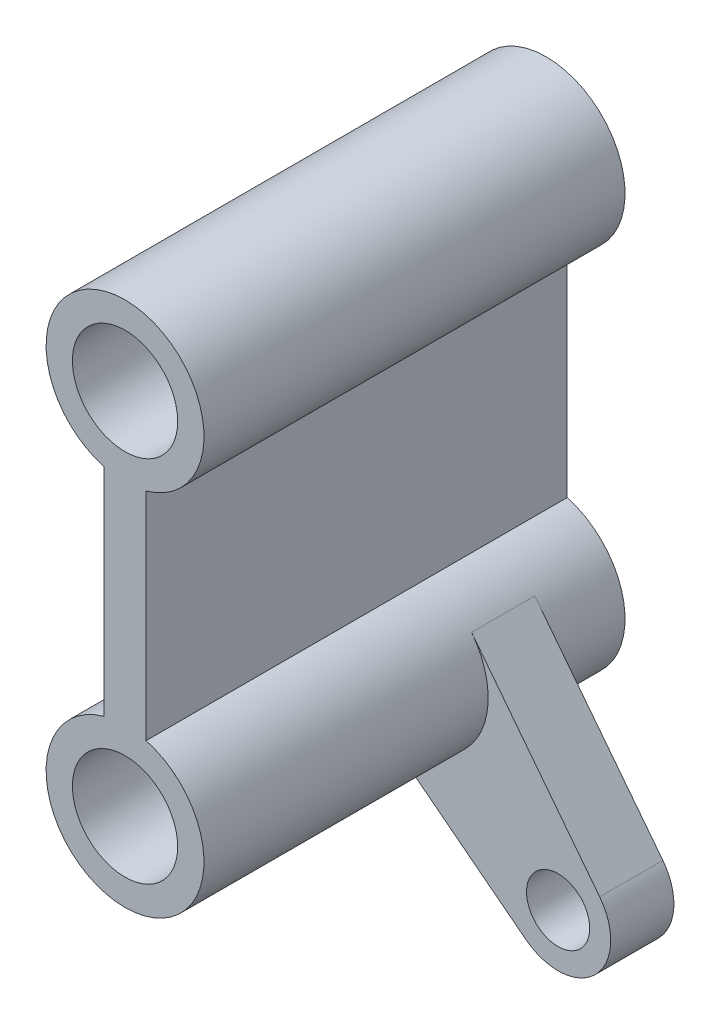
ISO-10303-21;
HEADER;
FILE_DESCRIPTION(('STEP AP214'),'2;1');
FILE_NAME('part.step','',(''),(''),'','','');
FILE_SCHEMA(('AUTOMOTIVE_DESIGN { 1 0 10303 214 1 1 1 1 }'));
ENDSEC;
DATA;
#1=APPLICATION_CONTEXT('core data for automotive mechanical design processes');
#2=APPLICATION_PROTOCOL_DEFINITION('international standard','automotive_design',2000,#1);
#3=PRODUCT_CONTEXT('',#1,'mechanical');
#4=PRODUCT('Part','Part','',(#3));
#5=PRODUCT_RELATED_PRODUCT_CATEGORY('part','',(#4));
#6=PRODUCT_DEFINITION_FORMATION('','',#4);
#7=PRODUCT_DEFINITION_CONTEXT('part definition',#1,'design');
#8=PRODUCT_DEFINITION('design','',#6,#7);
#9=PRODUCT_DEFINITION_SHAPE('','',#8);
#10=(LENGTH_UNIT() NAMED_UNIT(*) SI_UNIT(.MILLI.,.METRE.));
#11=(NAMED_UNIT(*) PLANE_ANGLE_UNIT() SI_UNIT($,.RADIAN.));
#12=(NAMED_UNIT(*) SI_UNIT($,.STERADIAN.) SOLID_ANGLE_UNIT());
#13=UNCERTAINTY_MEASURE_WITH_UNIT(LENGTH_MEASURE(1.E-05),#10,'distance_accuracy_value','');
#14=(GEOMETRIC_REPRESENTATION_CONTEXT(3) GLOBAL_UNCERTAINTY_ASSIGNED_CONTEXT((#13)) GLOBAL_UNIT_ASSIGNED_CONTEXT((#10,
#11,#12)) REPRESENTATION_CONTEXT('',''));
#15=CARTESIAN_POINT('',(0.,0.,0.));
#16=DIRECTION('',(0.,0.,1.));
#17=DIRECTION('',(1.,0.,0.));
#18=AXIS2_PLACEMENT_3D('',#15,#16,#17);
#19=CARTESIAN_POINT('',(0.,0.,40.));
#20=DIRECTION('',(0.,0.,-1.));
#21=DIRECTION('',(-1.,0.,0.));
#22=AXIS2_PLACEMENT_3D('',#19,#20,#21);
#23=CYLINDRICAL_SURFACE('',#22,7.5);
#24=DIRECTION('',(0.,0.,1.));
#25=VECTOR('',#24,1.);
#26=CARTESIAN_POINT('',(5.92461830751323,4.59879309278847,7.));
#27=LINE('',#26,#25);
#28=CARTESIAN_POINT('',(5.92461830751323,4.59879309278847,7.));
#29=VERTEX_POINT('',#28);
#30=CARTESIAN_POINT('',(5.92461830751324,4.59879309278848,13.));
#31=VERTEX_POINT('',#30);
#32=EDGE_CURVE('E62',#29,#31,#27,.T.);
#33=ORIENTED_EDGE('',*,*,#32,.F.);
#34=CARTESIAN_POINT('',(0.,0.,7.));
#35=DIRECTION('',(0.,0.,-1.));
#36=DIRECTION('',(-1.,0.,0.));
#37=AXIS2_PLACEMENT_3D('',#34,#35,#36);
#38=CIRCLE('',#37,7.5);
#39=CARTESIAN_POINT('',(-4.59879309278845,-5.92461830751325,7.));
#40=VERTEX_POINT('',#39);
#41=EDGE_CURVE('E66',#29,#40,#38,.T.);
#42=ORIENTED_EDGE('',*,*,#41,.T.);
#43=DIRECTION('',(0.,0.,1.));
#44=VECTOR('',#43,1.);
#45=CARTESIAN_POINT('',(-4.59879309278846,-5.92461830751325,7.));
#46=LINE('',#45,#44);
#47=CARTESIAN_POINT('',(-4.59879309278846,-5.92461830751325,13.));
#48=VERTEX_POINT('',#47);
#49=EDGE_CURVE('E140',#40,#48,#46,.T.);
#50=ORIENTED_EDGE('',*,*,#49,.T.);
#51=CARTESIAN_POINT('',(0.,0.,13.));
#52=DIRECTION('',(0.,0.,-1.));
#53=DIRECTION('',(-1.,0.,0.));
#54=AXIS2_PLACEMENT_3D('',#51,#52,#53);
#55=CIRCLE('',#54,7.5);
#56=EDGE_CURVE('E146',#31,#48,#55,.T.);
#57=ORIENTED_EDGE('',*,*,#56,.F.);
#58=EDGE_LOOP('',(#33,#42,#50,#57));
#59=FACE_BOUND('',#58,.T.);
#60=CARTESIAN_POINT('',(0.,0.,0.));
#61=DIRECTION('',(0.,0.,1.));
#62=DIRECTION('',(1.,0.,0.));
#63=AXIS2_PLACEMENT_3D('',#60,#61,#62);
#64=CIRCLE('',#63,7.5);
#65=CARTESIAN_POINT('',(-2.,7.22841614740048,0.));
#66=VERTEX_POINT('',#65);
#67=CARTESIAN_POINT('',(2.,7.22841614740048,0.));
#68=VERTEX_POINT('',#67);
#69=EDGE_CURVE('E150',#66,#68,#64,.T.);
#70=ORIENTED_EDGE('',*,*,#69,.T.);
#71=DIRECTION('',(0.,0.,-1.));
#72=VECTOR('',#71,1.);
#73=CARTESIAN_POINT('',(2.,7.22841614740048,40.));
#74=LINE('',#73,#72);
#75=CARTESIAN_POINT('',(2.,7.22841614740048,40.));
#76=VERTEX_POINT('',#75);
#77=EDGE_CURVE('E13',#76,#68,#74,.T.);
#78=ORIENTED_EDGE('',*,*,#77,.F.);
#79=CARTESIAN_POINT('',(0.,0.,40.));
#80=DIRECTION('',(0.,0.,1.));
#81=DIRECTION('',(1.,0.,0.));
#82=AXIS2_PLACEMENT_3D('',#79,#80,#81);
#83=CIRCLE('',#82,7.5);
#84=CARTESIAN_POINT('',(-2.,7.22841614740048,40.));
#85=VERTEX_POINT('',#84);
#86=EDGE_CURVE('E151',#85,#76,#83,.T.);
#87=ORIENTED_EDGE('',*,*,#86,.F.);
#88=DIRECTION('',(0.,0.,-1.));
#89=VECTOR('',#88,1.);
#90=CARTESIAN_POINT('',(-2.,7.22841614740048,40.));
#91=LINE('',#90,#89);
#92=EDGE_CURVE('E168',#85,#66,#91,.T.);
#93=ORIENTED_EDGE('',*,*,#92,.T.);
#94=EDGE_LOOP('',(#70,#78,#87,#93));
#95=FACE_BOUND('',#94,.T.);
#96=ADVANCED_FACE('F48',(#59,#95),#23,.T.);
#97=CARTESIAN_POINT('',(2.,0.,40.));
#98=DIRECTION('',(-1.,0.,0.));
#99=DIRECTION('',(0.,-1.,0.));
#100=AXIS2_PLACEMENT_3D('',#97,#98,#99);
#101=PLANE('',#100);
#102=DIRECTION('',(0.,1.,0.));
#103=VECTOR('',#102,1.);
#104=CARTESIAN_POINT('',(2.,0.,0.));
#105=LINE('',#104,#103);
#106=CARTESIAN_POINT('',(2.,27.7715838525995,0.));
#107=VERTEX_POINT('',#106);
#108=EDGE_CURVE('E171',#68,#107,#105,.T.);
#109=ORIENTED_EDGE('',*,*,#108,.T.);
#110=DIRECTION('',(0.,0.,-1.));
#111=VECTOR('',#110,1.);
#112=CARTESIAN_POINT('',(2.,27.7715838525995,40.));
#113=LINE('',#112,#111);
#114=CARTESIAN_POINT('',(2.,27.7715838525995,40.));
#115=VERTEX_POINT('',#114);
#116=EDGE_CURVE('E55',#115,#107,#113,.T.);
#117=ORIENTED_EDGE('',*,*,#116,.F.);
#118=DIRECTION('',(0.,1.,0.));
#119=VECTOR('',#118,1.);
#120=CARTESIAN_POINT('',(2.,0.,40.));
#121=LINE('',#120,#119);
#122=EDGE_CURVE('E154',#76,#115,#121,.T.);
#123=ORIENTED_EDGE('',*,*,#122,.F.);
#124=ORIENTED_EDGE('',*,*,#77,.T.);
#125=EDGE_LOOP('',(#109,#117,#123,#124));
#126=FACE_BOUND('',#125,.T.);
#127=ADVANCED_FACE('F207',(#126),#101,.F.);
#128=CARTESIAN_POINT('',(0.,35.,40.));
#129=DIRECTION('',(0.,0.,-1.));
#130=DIRECTION('',(-1.,0.,0.));
#131=AXIS2_PLACEMENT_3D('',#128,#129,#130);
#132=CYLINDRICAL_SURFACE('',#131,7.5);
#133=CARTESIAN_POINT('',(0.,35.,0.));
#134=DIRECTION('',(0.,0.,1.));
#135=DIRECTION('',(1.,0.,0.));
#136=AXIS2_PLACEMENT_3D('',#133,#134,#135);
#137=CIRCLE('',#136,7.5);
#138=CARTESIAN_POINT('',(-2.,27.7715838525995,0.));
#139=VERTEX_POINT('',#138);
#140=EDGE_CURVE('E173',#107,#139,#137,.T.);
#141=ORIENTED_EDGE('',*,*,#140,.T.);
#142=DIRECTION('',(0.,0.,-1.));
#143=VECTOR('',#142,1.);
#144=CARTESIAN_POINT('',(-2.,27.7715838525995,40.));
#145=LINE('',#144,#143);
#146=CARTESIAN_POINT('',(-2.,27.7715838525995,40.));
#147=VERTEX_POINT('',#146);
#148=EDGE_CURVE('E185',#147,#139,#145,.T.);
#149=ORIENTED_EDGE('',*,*,#148,.F.);
#150=CARTESIAN_POINT('',(0.,35.,40.));
#151=DIRECTION('',(0.,0.,1.));
#152=DIRECTION('',(1.,0.,0.));
#153=AXIS2_PLACEMENT_3D('',#150,#151,#152);
#154=CIRCLE('',#153,7.5);
#155=EDGE_CURVE('E157',#115,#147,#154,.T.);
#156=ORIENTED_EDGE('',*,*,#155,.F.);
#157=ORIENTED_EDGE('',*,*,#116,.T.);
#158=EDGE_LOOP('',(#141,#149,#156,#157));
#159=FACE_BOUND('',#158,.T.);
#160=ADVANCED_FACE('F191',(#159),#132,.T.);
#161=CARTESIAN_POINT('',(0.,0.,40.));
#162=DIRECTION('',(0.,0.,-1.));
#163=DIRECTION('',(-1.,0.,0.));
#164=AXIS2_PLACEMENT_3D('',#161,#162,#163);
#165=CYLINDRICAL_SURFACE('',#164,5.);
#166=CARTESIAN_POINT('',(0.,0.,40.));
#167=DIRECTION('',(0.,0.,1.));
#168=DIRECTION('',(1.,0.,0.));
#169=AXIS2_PLACEMENT_3D('',#166,#167,#168);
#170=CIRCLE('',#169,5.);
#171=CARTESIAN_POINT('',(5.,0.,40.));
#172=VERTEX_POINT('',#171);
#173=EDGE_CURVE('E162',#172,#172,#170,.T.);
#174=ORIENTED_EDGE('',*,*,#173,.T.);
#175=EDGE_LOOP('',(#174));
#176=FACE_BOUND('',#175,.T.);
#177=CARTESIAN_POINT('',(0.,0.,0.));
#178=DIRECTION('',(0.,0.,1.));
#179=DIRECTION('',(1.,0.,0.));
#180=AXIS2_PLACEMENT_3D('',#177,#178,#179);
#181=CIRCLE('',#180,5.);
#182=CARTESIAN_POINT('',(5.,0.,0.));
#183=VERTEX_POINT('',#182);
#184=EDGE_CURVE('E179',#183,#183,#181,.T.);
#185=ORIENTED_EDGE('',*,*,#184,.F.);
#186=EDGE_LOOP('',(#185));
#187=FACE_BOUND('',#186,.T.);
#188=ADVANCED_FACE('F216',(#176,#187),#165,.F.);
#189=CARTESIAN_POINT('',(-2.,0.,40.));
#190=DIRECTION('',(-1.,0.,0.));
#191=DIRECTION('',(0.,0.,1.));
#192=AXIS2_PLACEMENT_3D('',#189,#190,#191);
#193=PLANE('',#192);
#194=DIRECTION('',(0.,1.,0.));
#195=VECTOR('',#194,1.);
#196=CARTESIAN_POINT('',(-2.,0.,0.));
#197=LINE('',#196,#195);
#198=EDGE_CURVE('E176',#66,#139,#197,.T.);
#199=ORIENTED_EDGE('',*,*,#198,.F.);
#200=ORIENTED_EDGE('',*,*,#92,.F.);
#201=DIRECTION('',(0.,1.,0.));
#202=VECTOR('',#201,1.);
#203=CARTESIAN_POINT('',(-2.,0.,40.));
#204=LINE('',#203,#202);
#205=EDGE_CURVE('E159',#85,#147,#204,.T.);
#206=ORIENTED_EDGE('',*,*,#205,.T.);
#207=ORIENTED_EDGE('',*,*,#148,.T.);
#208=EDGE_LOOP('',(#199,#200,#206,#207));
#209=FACE_BOUND('',#208,.T.);
#210=ADVANCED_FACE('F200',(#209),#193,.T.);
#211=CARTESIAN_POINT('',(0.,35.,40.));
#212=DIRECTION('',(0.,0.,-1.));
#213=DIRECTION('',(-1.,0.,0.));
#214=AXIS2_PLACEMENT_3D('',#211,#212,#213);
#215=CYLINDRICAL_SURFACE('',#214,5.);
#216=CARTESIAN_POINT('',(0.,35.,40.));
#217=DIRECTION('',(0.,0.,1.));
#218=DIRECTION('',(1.,0.,0.));
#219=AXIS2_PLACEMENT_3D('',#216,#217,#218);
#220=CIRCLE('',#219,5.);
#221=CARTESIAN_POINT('',(5.,35.,40.));
#222=VERTEX_POINT('',#221);
#223=EDGE_CURVE('E165',#222,#222,#220,.T.);
#224=ORIENTED_EDGE('',*,*,#223,.T.);
#225=EDGE_LOOP('',(#224));
#226=FACE_BOUND('',#225,.T.);
#227=CARTESIAN_POINT('',(0.,35.,0.));
#228=DIRECTION('',(0.,0.,1.));
#229=DIRECTION('',(1.,0.,0.));
#230=AXIS2_PLACEMENT_3D('',#227,#228,#229);
#231=CIRCLE('',#230,5.);
#232=CARTESIAN_POINT('',(5.,35.,0.));
#233=VERTEX_POINT('',#232);
#234=EDGE_CURVE('E155',#233,#233,#231,.T.);
#235=ORIENTED_EDGE('',*,*,#234,.F.);
#236=EDGE_LOOP('',(#235));
#237=FACE_BOUND('',#236,.T.);
#238=ADVANCED_FACE('F221',(#226,#237),#215,.F.);
#239=CARTESIAN_POINT('',(0.,0.,40.));
#240=DIRECTION('',(0.,0.,1.));
#241=DIRECTION('',(1.,0.,0.));
#242=AXIS2_PLACEMENT_3D('',#239,#240,#241);
#243=PLANE('',#242);
#244=ORIENTED_EDGE('',*,*,#86,.T.);
#245=ORIENTED_EDGE('',*,*,#122,.T.);
#246=ORIENTED_EDGE('',*,*,#155,.T.);
#247=ORIENTED_EDGE('',*,*,#205,.F.);
#248=EDGE_LOOP('',(#244,#245,#246,#247));
#249=FACE_BOUND('',#248,.T.);
#250=ORIENTED_EDGE('',*,*,#173,.F.);
#251=EDGE_LOOP('',(#250));
#252=FACE_BOUND('',#251,.T.);
#253=ORIENTED_EDGE('',*,*,#223,.F.);
#254=EDGE_LOOP('',(#253));
#255=FACE_BOUND('',#254,.T.);
#256=ADVANCED_FACE('F204',(#249,#252,#255),#243,.T.);
#257=CARTESIAN_POINT('',(0.,0.,0.));
#258=DIRECTION('',(0.,0.,1.));
#259=DIRECTION('',(1.,0.,0.));
#260=AXIS2_PLACEMENT_3D('',#257,#258,#259);
#261=PLANE('',#260);
#262=ORIENTED_EDGE('',*,*,#69,.F.);
#263=ORIENTED_EDGE('',*,*,#198,.T.);
#264=ORIENTED_EDGE('',*,*,#140,.F.);
#265=ORIENTED_EDGE('',*,*,#108,.F.);
#266=EDGE_LOOP('',(#262,#263,#264,#265));
#267=FACE_BOUND('',#266,.T.);
#268=ORIENTED_EDGE('',*,*,#184,.T.);
#269=EDGE_LOOP('',(#268));
#270=FACE_BOUND('',#269,.T.);
#271=ORIENTED_EDGE('',*,*,#234,.T.);
#272=EDGE_LOOP('',(#271));
#273=FACE_BOUND('',#272,.T.);
#274=ADVANCED_FACE('F196',(#267,#270,#273),#261,.F.);
#275=CARTESIAN_POINT('',(0.,0.,7.));
#276=DIRECTION('',(0.,0.,-1.));
#277=DIRECTION('',(-1.,0.,0.));
#278=AXIS2_PLACEMENT_3D('',#275,#276,#277);
#279=PLANE('',#278);
#280=CARTESIAN_POINT('',(14.142135623731,-14.1421356237309,7.));
#281=DIRECTION('',(0.,0.,-1.));
#282=DIRECTION('',(-1.,0.,0.));
#283=AXIS2_PLACEMENT_3D('',#280,#281,#282);
#284=CIRCLE('',#283,3.);
#285=CARTESIAN_POINT('',(11.142135623731,-14.1421356237309,7.));
#286=VERTEX_POINT('',#285);
#287=EDGE_CURVE('E136',#286,#286,#284,.T.);
#288=ORIENTED_EDGE('',*,*,#287,.F.);
#289=EDGE_LOOP('',(#288));
#290=FACE_BOUND('',#289,.T.);
#291=ORIENTED_EDGE('',*,*,#41,.F.);
#292=DIRECTION('',(-0.613172412371797,0.789949107668431,0.));
#293=VECTOR('',#292,1.);
#294=CARTESIAN_POINT('',(5.92461830751323,4.59879309278847,7.));
#295=LINE('',#294,#293);
#296=CARTESIAN_POINT('',(18.0918811620731,-11.0762735618719,7.));
#297=VERTEX_POINT('',#296);
#298=EDGE_CURVE('E114',#297,#29,#295,.T.);
#299=ORIENTED_EDGE('',*,*,#298,.F.);
#300=CARTESIAN_POINT('',(14.142135623731,-14.1421356237309,7.));
#301=DIRECTION('',(0.,0.,-1.));
#302=DIRECTION('',(-1.,0.,0.));
#303=AXIS2_PLACEMENT_3D('',#300,#301,#302);
#304=CIRCLE('',#303,5.);
#305=CARTESIAN_POINT('',(11.076273561872,-18.0918811620731,7.));
#306=VERTEX_POINT('',#305);
#307=EDGE_CURVE('E122',#297,#306,#304,.T.);
#308=ORIENTED_EDGE('',*,*,#307,.T.);
#309=DIRECTION('',(-0.789949107668434,0.613172412371794,0.));
#310=VECTOR('',#309,1.);
#311=CARTESIAN_POINT('',(-4.59879309278846,-5.92461830751325,7.));
#312=LINE('',#311,#310);
#313=EDGE_CURVE('E127',#306,#40,#312,.T.);
#314=ORIENTED_EDGE('',*,*,#313,.T.);
#315=EDGE_LOOP('',(#291,#299,#308,#314));
#316=FACE_BOUND('',#315,.T.);
#317=ADVANCED_FACE('F129',(#290,#316),#279,.T.);
#318=CARTESIAN_POINT('',(0.,0.,13.));
#319=DIRECTION('',(0.,0.,-1.));
#320=DIRECTION('',(-1.,0.,0.));
#321=AXIS2_PLACEMENT_3D('',#318,#319,#320);
#322=PLANE('',#321);
#323=CARTESIAN_POINT('',(14.142135623731,-14.1421356237309,13.));
#324=DIRECTION('',(0.,0.,1.));
#325=DIRECTION('',(1.,0.,0.));
#326=AXIS2_PLACEMENT_3D('',#323,#324,#325);
#327=CIRCLE('',#326,3.);
#328=CARTESIAN_POINT('',(17.142135623731,-14.1421356237309,13.));
#329=VERTEX_POINT('',#328);
#330=EDGE_CURVE('E257',#329,#329,#327,.T.);
#331=ORIENTED_EDGE('',*,*,#330,.F.);
#332=EDGE_LOOP('',(#331));
#333=FACE_BOUND('',#332,.T.);
#334=DIRECTION('',(-0.613172412371797,0.789949107668431,0.));
#335=VECTOR('',#334,1.);
#336=CARTESIAN_POINT('',(5.92461830751323,4.59879309278847,13.));
#337=LINE('',#336,#335);
#338=CARTESIAN_POINT('',(18.0918811620731,-11.0762735618719,13.));
#339=VERTEX_POINT('',#338);
#340=EDGE_CURVE('E116',#339,#31,#337,.T.);
#341=ORIENTED_EDGE('',*,*,#340,.T.);
#342=ORIENTED_EDGE('',*,*,#56,.T.);
#343=DIRECTION('',(-0.789949107668434,0.613172412371794,0.));
#344=VECTOR('',#343,1.);
#345=CARTESIAN_POINT('',(-4.59879309278846,-5.92461830751325,13.));
#346=LINE('',#345,#344);
#347=CARTESIAN_POINT('',(11.076273561872,-18.0918811620731,13.));
#348=VERTEX_POINT('',#347);
#349=EDGE_CURVE('E130',#348,#48,#346,.T.);
#350=ORIENTED_EDGE('',*,*,#349,.F.);
#351=CARTESIAN_POINT('',(14.142135623731,-14.1421356237309,13.));
#352=DIRECTION('',(0.,0.,-1.));
#353=DIRECTION('',(-1.,0.,0.));
#354=AXIS2_PLACEMENT_3D('',#351,#352,#353);
#355=CIRCLE('',#354,5.);
#356=EDGE_CURVE('E133',#339,#348,#355,.T.);
#357=ORIENTED_EDGE('',*,*,#356,.F.);
#358=EDGE_LOOP('',(#341,#342,#350,#357));
#359=FACE_BOUND('',#358,.T.);
#360=ADVANCED_FACE('F234',(#333,#359),#322,.F.);
#361=CARTESIAN_POINT('',(5.92461830751323,4.59879309278847,7.));
#362=DIRECTION('',(0.789949107668431,0.613172412371797,0.));
#363=DIRECTION('',(-0.613172412371797,0.789949107668431,0.));
#364=AXIS2_PLACEMENT_3D('',#361,#362,#363);
#365=PLANE('',#364);
#366=ORIENTED_EDGE('',*,*,#340,.F.);
#367=DIRECTION('',(0.,0.,1.));
#368=VECTOR('',#367,1.);
#369=CARTESIAN_POINT('',(18.0918811620731,-11.0762735618719,7.));
#370=LINE('',#369,#368);
#371=EDGE_CURVE('E110',#297,#339,#370,.T.);
#372=ORIENTED_EDGE('',*,*,#371,.F.);
#373=ORIENTED_EDGE('',*,*,#298,.T.);
#374=ORIENTED_EDGE('',*,*,#32,.T.);
#375=EDGE_LOOP('',(#366,#372,#373,#374));
#376=FACE_BOUND('',#375,.T.);
#377=ADVANCED_FACE('F112',(#376),#365,.T.);
#378=CARTESIAN_POINT('',(14.142135623731,-14.1421356237309,7.));
#379=DIRECTION('',(0.,0.,1.));
#380=DIRECTION('',(1.,0.,0.));
#381=AXIS2_PLACEMENT_3D('',#378,#379,#380);
#382=CYLINDRICAL_SURFACE('',#381,5.);
#383=ORIENTED_EDGE('',*,*,#356,.T.);
#384=DIRECTION('',(0.,0.,1.));
#385=VECTOR('',#384,1.);
#386=CARTESIAN_POINT('',(11.076273561872,-18.0918811620731,7.));
#387=LINE('',#386,#385);
#388=EDGE_CURVE('E119',#306,#348,#387,.T.);
#389=ORIENTED_EDGE('',*,*,#388,.F.);
#390=ORIENTED_EDGE('',*,*,#307,.F.);
#391=ORIENTED_EDGE('',*,*,#371,.T.);
#392=EDGE_LOOP('',(#383,#389,#390,#391));
#393=FACE_BOUND('',#392,.T.);
#394=ADVANCED_FACE('F123',(#393),#382,.T.);
#395=CARTESIAN_POINT('',(-4.59879309278846,-5.92461830751325,7.));
#396=DIRECTION('',(0.613172412371794,0.789949107668433,0.));
#397=DIRECTION('',(-0.789949107668434,0.613172412371794,0.));
#398=AXIS2_PLACEMENT_3D('',#395,#396,#397);
#399=PLANE('',#398);
#400=ORIENTED_EDGE('',*,*,#349,.T.);
#401=ORIENTED_EDGE('',*,*,#49,.F.);
#402=ORIENTED_EDGE('',*,*,#313,.F.);
#403=ORIENTED_EDGE('',*,*,#388,.T.);
#404=EDGE_LOOP('',(#400,#401,#402,#403));
#405=FACE_BOUND('',#404,.T.);
#406=ADVANCED_FACE('F237',(#405),#399,.F.);
#407=CARTESIAN_POINT('',(14.142135623731,-14.1421356237309,0.));
#408=DIRECTION('',(0.,0.,1.));
#409=DIRECTION('',(1.,0.,0.));
#410=AXIS2_PLACEMENT_3D('',#407,#408,#409);
#411=CYLINDRICAL_SURFACE('',#410,3.);
#412=ORIENTED_EDGE('',*,*,#287,.T.);
#413=EDGE_LOOP('',(#412));
#414=FACE_BOUND('',#413,.T.);
#415=ORIENTED_EDGE('',*,*,#330,.T.);
#416=EDGE_LOOP('',(#415));
#417=FACE_BOUND('',#416,.T.);
#418=ADVANCED_FACE('F240',(#414,#417),#411,.F.);
#419=CLOSED_SHELL('',(#96,#127,#160,#188,#210,#238,#256,#274,#317,#360,#377,#394,#406,#418));
#420=MANIFOLD_SOLID_BREP('B2',#419);
#421=ADVANCED_BREP_SHAPE_REPRESENTATION('',(#18,#420),#14);
#422=SHAPE_DEFINITION_REPRESENTATION(#9,#421);
ENDSEC;
END-ISO-10303-21;
